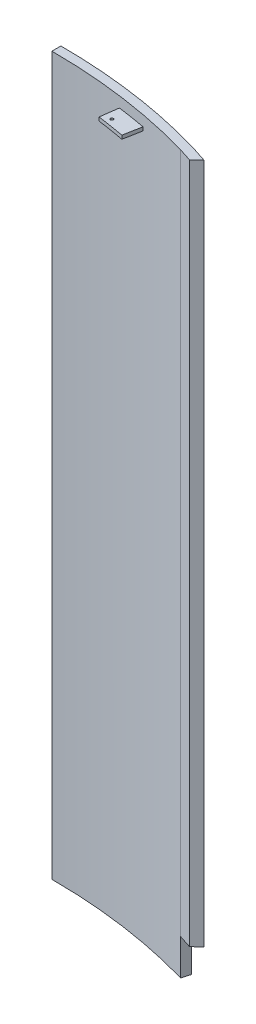
ISO-10303-21;
HEADER;
FILE_DESCRIPTION(('STEP AP214'),'2;1');
FILE_NAME('part.step','',(''),(''),'','','');
FILE_SCHEMA(('AUTOMOTIVE_DESIGN { 1 0 10303 214 1 1 1 1 }'));
ENDSEC;
DATA;
#1=APPLICATION_CONTEXT('core data for automotive mechanical design processes');
#2=APPLICATION_PROTOCOL_DEFINITION('international standard','automotive_design',2000,#1);
#3=PRODUCT_CONTEXT('',#1,'mechanical');
#4=PRODUCT('Part','Part','',(#3));
#5=PRODUCT_RELATED_PRODUCT_CATEGORY('part','',(#4));
#6=PRODUCT_DEFINITION_FORMATION('','',#4);
#7=PRODUCT_DEFINITION_CONTEXT('part definition',#1,'design');
#8=PRODUCT_DEFINITION('design','',#6,#7);
#9=PRODUCT_DEFINITION_SHAPE('','',#8);
#10=(LENGTH_UNIT() NAMED_UNIT(*) SI_UNIT(.MILLI.,.METRE.));
#11=(NAMED_UNIT(*) PLANE_ANGLE_UNIT() SI_UNIT($,.RADIAN.));
#12=(NAMED_UNIT(*) SI_UNIT($,.STERADIAN.) SOLID_ANGLE_UNIT());
#13=UNCERTAINTY_MEASURE_WITH_UNIT(LENGTH_MEASURE(1.E-05),#10,'distance_accuracy_value','');
#14=(GEOMETRIC_REPRESENTATION_CONTEXT(3) GLOBAL_UNCERTAINTY_ASSIGNED_CONTEXT((#13)) GLOBAL_UNIT_ASSIGNED_CONTEXT((#10,
#11,#12)) REPRESENTATION_CONTEXT('',''));
#15=CARTESIAN_POINT('',(0.,0.,0.));
#16=DIRECTION('',(0.,0.,1.));
#17=DIRECTION('',(1.,0.,0.));
#18=AXIS2_PLACEMENT_3D('',#15,#16,#17);
#19=CARTESIAN_POINT('',(0.,2000.,0.));
#20=DIRECTION('',(0.,-1.,0.));
#21=DIRECTION('',(0.,0.,-1.));
#22=AXIS2_PLACEMENT_3D('',#19,#20,#21);
#23=CYLINDRICAL_SURFACE('',#22,1540.);
#24=CARTESIAN_POINT('',(0.,0.,0.));
#25=DIRECTION('',(0.,1.,0.));
#26=DIRECTION('',(0.,0.,-1.));
#27=AXIS2_PLACEMENT_3D('',#24,#25,#26);
#28=CIRCLE('',#27,1540.);
#29=CARTESIAN_POINT('',(424.481527958169,0.,-1480.34301174501));
#30=VERTEX_POINT('',#29);
#31=CARTESIAN_POINT('',(0.,0.,-1540.));
#32=VERTEX_POINT('',#31);
#33=EDGE_CURVE('E169',#30,#32,#28,.T.);
#34=ORIENTED_EDGE('',*,*,#33,.T.);
#35=DIRECTION('',(0.,-1.,0.));
#36=VECTOR('',#35,1.);
#37=CARTESIAN_POINT('',(0.,2000.,-1540.));
#38=LINE('',#37,#36);
#39=CARTESIAN_POINT('',(0.,2000.,-1540.));
#40=VERTEX_POINT('',#39);
#41=EDGE_CURVE('E11',#40,#32,#38,.T.);
#42=ORIENTED_EDGE('',*,*,#41,.F.);
#43=CARTESIAN_POINT('',(0.,2000.,0.));
#44=DIRECTION('',(0.,1.,0.));
#45=DIRECTION('',(0.,0.,-1.));
#46=AXIS2_PLACEMENT_3D('',#43,#44,#45);
#47=CIRCLE('',#46,1540.);
#48=CARTESIAN_POINT('',(424.481527958166,2000.,-1480.34301174501));
#49=VERTEX_POINT('',#48);
#50=EDGE_CURVE('E184',#49,#40,#47,.T.);
#51=ORIENTED_EDGE('',*,*,#50,.F.);
#52=DIRECTION('',(0.,-1.,0.));
#53=VECTOR('',#52,1.);
#54=CARTESIAN_POINT('',(424.481527958169,2000.,-1480.34301174501));
#55=LINE('',#54,#53);
#56=CARTESIAN_POINT('',(424.481527958166,100.,-1480.34301174501));
#57=VERTEX_POINT('',#56);
#58=EDGE_CURVE('E203',#49,#57,#55,.T.);
#59=ORIENTED_EDGE('',*,*,#58,.T.);
#60=EDGE_CURVE('E193',#57,#30,#55,.T.);
#61=ORIENTED_EDGE('',*,*,#60,.T.);
#62=EDGE_LOOP('',(#34,#42,#51,#59,#61));
#63=FACE_BOUND('',#62,.T.);
#64=ADVANCED_FACE('F36',(#63),#23,.T.);
#65=CARTESIAN_POINT('',(0.,2000.,-1540.));
#66=DIRECTION('',(1.,0.,0.));
#67=DIRECTION('',(0.,0.,-1.));
#68=AXIS2_PLACEMENT_3D('',#65,#66,#67);
#69=PLANE('',#68);
#70=DIRECTION('',(0.,0.,1.));
#71=VECTOR('',#70,1.);
#72=CARTESIAN_POINT('',(0.,0.,-1540.));
#73=LINE('',#72,#71);
#74=CARTESIAN_POINT('',(0.,0.,-1515.));
#75=VERTEX_POINT('',#74);
#76=EDGE_CURVE('E196',#32,#75,#73,.T.);
#77=ORIENTED_EDGE('',*,*,#76,.T.);
#78=DIRECTION('',(0.,-1.,0.));
#79=VECTOR('',#78,1.);
#80=CARTESIAN_POINT('',(0.,2000.,-1515.));
#81=LINE('',#80,#79);
#82=CARTESIAN_POINT('',(0.,2000.,-1515.));
#83=VERTEX_POINT('',#82);
#84=EDGE_CURVE('E43',#83,#75,#81,.T.);
#85=ORIENTED_EDGE('',*,*,#84,.F.);
#86=DIRECTION('',(0.,0.,1.));
#87=VECTOR('',#86,1.);
#88=CARTESIAN_POINT('',(0.,2000.,-1540.));
#89=LINE('',#88,#87);
#90=EDGE_CURVE('E187',#40,#83,#89,.T.);
#91=ORIENTED_EDGE('',*,*,#90,.F.);
#92=ORIENTED_EDGE('',*,*,#41,.T.);
#93=EDGE_LOOP('',(#77,#85,#91,#92));
#94=FACE_BOUND('',#93,.T.);
#95=ADVANCED_FACE('F239',(#94),#69,.F.);
#96=CARTESIAN_POINT('',(0.,2000.,0.));
#97=DIRECTION('',(0.,-1.,0.));
#98=DIRECTION('',(0.,0.,-1.));
#99=AXIS2_PLACEMENT_3D('',#96,#97,#98);
#100=CYLINDRICAL_SURFACE('',#99,1515.);
#101=DIRECTION('',(0.,1.,0.));
#102=VECTOR('',#101,1.);
#103=CARTESIAN_POINT('',(279.985715854306,1960.4,-1488.9032872949));
#104=LINE('',#103,#102);
#105=CARTESIAN_POINT('',(279.985715854306,1960.4,-1488.9032872949));
#106=VERTEX_POINT('',#105);
#107=CARTESIAN_POINT('',(279.985715854306,1970.4,-1488.9032872949));
#108=VERTEX_POINT('',#107);
#109=EDGE_CURVE('E55',#106,#108,#104,.T.);
#110=ORIENTED_EDGE('',*,*,#109,.F.);
#111=CARTESIAN_POINT('',(0.,1960.4,0.));
#112=DIRECTION('',(0.,1.,0.));
#113=DIRECTION('',(0.,0.,-1.));
#114=AXIS2_PLACEMENT_3D('',#111,#112,#113);
#115=CIRCLE('',#114,1515.);
#116=CARTESIAN_POINT('',(201.678827867692,1960.4,-1501.51611725946));
#117=VERTEX_POINT('',#116);
#118=EDGE_CURVE('E50',#106,#117,#115,.T.);
#119=ORIENTED_EDGE('',*,*,#118,.T.);
#120=DIRECTION('',(0.,1.,0.));
#121=VECTOR('',#120,1.);
#122=CARTESIAN_POINT('',(201.678827867692,1960.4,-1501.51611725946));
#123=LINE('',#122,#121);
#124=CARTESIAN_POINT('',(201.678827867692,1970.4,-1501.51611725946));
#125=VERTEX_POINT('',#124);
#126=EDGE_CURVE('E156',#117,#125,#123,.T.);
#127=ORIENTED_EDGE('',*,*,#126,.T.);
#128=CARTESIAN_POINT('',(0.,1970.4,0.));
#129=DIRECTION('',(0.,1.,0.));
#130=DIRECTION('',(0.,0.,-1.));
#131=AXIS2_PLACEMENT_3D('',#128,#129,#130);
#132=CIRCLE('',#131,1515.);
#133=EDGE_CURVE('E140',#108,#125,#132,.T.);
#134=ORIENTED_EDGE('',*,*,#133,.F.);
#135=EDGE_LOOP('',(#110,#119,#127,#134));
#136=FACE_BOUND('',#135,.T.);
#137=CARTESIAN_POINT('',(0.,0.,0.));
#138=DIRECTION('',(0.,-1.,0.));
#139=DIRECTION('',(0.,0.,-1.));
#140=AXIS2_PLACEMENT_3D('',#137,#138,#139);
#141=CIRCLE('',#140,1515.);
#142=CARTESIAN_POINT('',(417.590594062744,0.,-1456.31146934656));
#143=VERTEX_POINT('',#142);
#144=EDGE_CURVE('E198',#75,#143,#141,.T.);
#145=ORIENTED_EDGE('',*,*,#144,.T.);
#146=DIRECTION('',(0.,-1.,0.));
#147=VECTOR('',#146,1.);
#148=CARTESIAN_POINT('',(417.590594062744,2000.,-1456.31146934656));
#149=LINE('',#148,#147);
#150=CARTESIAN_POINT('',(417.590594062744,100.,-1456.31146934656));
#151=VERTEX_POINT('',#150);
#152=EDGE_CURVE('E206',#151,#143,#149,.T.);
#153=ORIENTED_EDGE('',*,*,#152,.F.);
#154=CARTESIAN_POINT('',(417.590594062741,2000.,-1456.31146934656));
#155=VERTEX_POINT('',#154);
#156=EDGE_CURVE('E207',#155,#151,#149,.T.);
#157=ORIENTED_EDGE('',*,*,#156,.F.);
#158=CARTESIAN_POINT('',(0.,2000.,0.));
#159=DIRECTION('',(0.,-1.,0.));
#160=DIRECTION('',(0.,0.,-1.));
#161=AXIS2_PLACEMENT_3D('',#158,#159,#160);
#162=CIRCLE('',#161,1515.);
#163=EDGE_CURVE('E190',#83,#155,#162,.T.);
#164=ORIENTED_EDGE('',*,*,#163,.F.);
#165=ORIENTED_EDGE('',*,*,#84,.T.);
#166=EDGE_LOOP('',(#145,#153,#157,#164,#165));
#167=FACE_BOUND('',#166,.T.);
#168=ADVANCED_FACE('F213',(#136,#167),#100,.F.);
#169=CARTESIAN_POINT('',(424.481527958169,2000.,-1480.34301174501));
#170=DIRECTION('',(-0.961261695938321,0.,-0.275637355816991));
#171=DIRECTION('',(-0.275637355816991,0.,0.961261695938321));
#172=AXIS2_PLACEMENT_3D('',#169,#170,#171);
#173=PLANE('',#172);
#174=ORIENTED_EDGE('',*,*,#60,.F.);
#175=DIRECTION('',(-0.275637355816991,0.,0.961261695938321));
#176=VECTOR('',#175,1.);
#177=CARTESIAN_POINT('',(0.,100.,0.));
#178=LINE('',#177,#176);
#179=EDGE_CURVE('E159',#57,#151,#178,.T.);
#180=ORIENTED_EDGE('',*,*,#179,.T.);
#181=ORIENTED_EDGE('',*,*,#152,.T.);
#182=DIRECTION('',(0.275637355816991,0.,-0.961261695938321));
#183=VECTOR('',#182,1.);
#184=CARTESIAN_POINT('',(424.481527958169,0.,-1480.34301174501));
#185=LINE('',#184,#183);
#186=EDGE_CURVE('E188',#143,#30,#185,.T.);
#187=ORIENTED_EDGE('',*,*,#186,.T.);
#188=EDGE_LOOP('',(#174,#180,#181,#187));
#189=FACE_BOUND('',#188,.T.);
#190=ADVANCED_FACE('F223',(#189),#173,.F.);
#191=CARTESIAN_POINT('',(0.,2000.,0.));
#192=DIRECTION('',(0.,-1.,0.));
#193=DIRECTION('',(0.,0.,-1.));
#194=AXIS2_PLACEMENT_3D('',#191,#192,#193);
#195=PLANE('',#194);
#196=ORIENTED_EDGE('',*,*,#50,.T.);
#197=ORIENTED_EDGE('',*,*,#90,.T.);
#198=ORIENTED_EDGE('',*,*,#163,.T.);
#199=DIRECTION('',(0.951056516295159,0.,0.30901699437493));
#200=VECTOR('',#199,1.);
#201=CARTESIAN_POINT('',(467.875555600545,2000.,-1439.97289491861));
#202=LINE('',#201,#200);
#203=CARTESIAN_POINT('',(454.156599519565,2000.,-1444.43045396108));
#204=VERTEX_POINT('',#203);
#205=EDGE_CURVE('E175',#155,#204,#202,.T.);
#206=ORIENTED_EDGE('',*,*,#205,.T.);
#207=DIRECTION('',(-0.743144825477387,0.,0.669130606358866));
#208=VECTOR('',#207,1.);
#209=CARTESIAN_POINT('',(-514.916702356049,2000.,-571.872933731195));
#210=LINE('',#209,#208);
#211=CARTESIAN_POINT('',(475.596274339822,2000.,-1463.73482387767));
#212=VERTEX_POINT('',#211);
#213=EDGE_CURVE('E155',#212,#204,#210,.T.);
#214=ORIENTED_EDGE('',*,*,#213,.F.);
#215=DIRECTION('',(0.951056516295161,0.,0.309016994374926));
#216=VECTOR('',#215,1.);
#217=CARTESIAN_POINT('',(475.596274339822,2000.,-1463.73482387767));
#218=LINE('',#217,#216);
#219=EDGE_CURVE('E172',#49,#212,#218,.T.);
#220=ORIENTED_EDGE('',*,*,#219,.F.);
#221=EDGE_LOOP('',(#196,#197,#198,#206,#214,#220));
#222=FACE_BOUND('',#221,.T.);
#223=ADVANCED_FACE('F236',(#222),#195,.F.);
#224=CARTESIAN_POINT('',(0.,0.,0.));
#225=DIRECTION('',(0.,-1.,0.));
#226=DIRECTION('',(0.,0.,-1.));
#227=AXIS2_PLACEMENT_3D('',#224,#225,#226);
#228=PLANE('',#227);
#229=ORIENTED_EDGE('',*,*,#33,.F.);
#230=ORIENTED_EDGE('',*,*,#186,.F.);
#231=ORIENTED_EDGE('',*,*,#144,.F.);
#232=ORIENTED_EDGE('',*,*,#76,.F.);
#233=EDGE_LOOP('',(#229,#230,#231,#232));
#234=FACE_BOUND('',#233,.T.);
#235=ADVANCED_FACE('F220',(#234),#228,.T.);
#236=CARTESIAN_POINT('',(475.596274339822,31.7770511411921,-1463.73482387767));
#237=DIRECTION('',(-0.309016994374926,0.,0.951056516295161));
#238=DIRECTION('',(0.951056516295161,0.,0.309016994374926));
#239=AXIS2_PLACEMENT_3D('',#236,#237,#238);
#240=PLANE('',#239);
#241=DIRECTION('',(0.,1.,0.));
#242=VECTOR('',#241,1.);
#243=CARTESIAN_POINT('',(475.596274339822,31.7770511411921,-1463.73482387767));
#244=LINE('',#243,#242);
#245=CARTESIAN_POINT('',(475.596274339822,100.,-1463.73482387767));
#246=VERTEX_POINT('',#245);
#247=EDGE_CURVE('E178',#246,#212,#244,.T.);
#248=ORIENTED_EDGE('',*,*,#247,.F.);
#249=DIRECTION('',(-0.951056516295161,0.,-0.309016994374926));
#250=VECTOR('',#249,1.);
#251=CARTESIAN_POINT('',(475.596274339822,100.,-1463.73482387767));
#252=LINE('',#251,#250);
#253=EDGE_CURVE('E163',#246,#57,#252,.T.);
#254=ORIENTED_EDGE('',*,*,#253,.T.);
#255=ORIENTED_EDGE('',*,*,#58,.F.);
#256=ORIENTED_EDGE('',*,*,#219,.T.);
#257=EDGE_LOOP('',(#248,#254,#255,#256));
#258=FACE_BOUND('',#257,.T.);
#259=ADVANCED_FACE('F242',(#258),#240,.F.);
#260=CARTESIAN_POINT('',(467.875555600545,31.7770511411921,-1439.97289491861));
#261=DIRECTION('',(-0.30901699437493,0.,0.951056516295159));
#262=DIRECTION('',(0.951056516295159,0.,0.30901699437493));
#263=AXIS2_PLACEMENT_3D('',#260,#261,#262);
#264=PLANE('',#263);
#265=DIRECTION('',(-0.951056516295159,0.,-0.30901699437493));
#266=VECTOR('',#265,1.);
#267=CARTESIAN_POINT('',(467.875555600545,100.,-1439.97289491861));
#268=LINE('',#267,#266);
#269=CARTESIAN_POINT('',(454.156599519565,100.,-1444.43045396108));
#270=VERTEX_POINT('',#269);
#271=EDGE_CURVE('E162',#270,#151,#268,.T.);
#272=ORIENTED_EDGE('',*,*,#271,.F.);
#273=DIRECTION('',(0.,1.,0.));
#274=VECTOR('',#273,1.);
#275=CARTESIAN_POINT('',(454.156599519565,31.7770511411921,-1444.43045396108));
#276=LINE('',#275,#274);
#277=EDGE_CURVE('E179',#270,#204,#276,.T.);
#278=ORIENTED_EDGE('',*,*,#277,.T.);
#279=ORIENTED_EDGE('',*,*,#205,.F.);
#280=ORIENTED_EDGE('',*,*,#156,.T.);
#281=EDGE_LOOP('',(#272,#278,#279,#280));
#282=FACE_BOUND('',#281,.T.);
#283=ADVANCED_FACE('F226',(#282),#264,.T.);
#284=CARTESIAN_POINT('',(-514.916702356049,31.7770511411921,-571.872933731195));
#285=DIRECTION('',(-0.669130606358866,0.,-0.743144825477387));
#286=DIRECTION('',(-0.743144825477387,0.,0.669130606358866));
#287=AXIS2_PLACEMENT_3D('',#284,#285,#286);
#288=PLANE('',#287);
#289=ORIENTED_EDGE('',*,*,#277,.F.);
#290=DIRECTION('',(0.743144825477387,0.,-0.669130606358866));
#291=VECTOR('',#290,1.);
#292=CARTESIAN_POINT('',(-514.916702356049,100.,-571.872933731195));
#293=LINE('',#292,#291);
#294=EDGE_CURVE('E166',#270,#246,#293,.T.);
#295=ORIENTED_EDGE('',*,*,#294,.T.);
#296=ORIENTED_EDGE('',*,*,#247,.T.);
#297=ORIENTED_EDGE('',*,*,#213,.T.);
#298=EDGE_LOOP('',(#289,#295,#296,#297));
#299=FACE_BOUND('',#298,.T.);
#300=ADVANCED_FACE('F232',(#299),#288,.F.);
#301=CARTESIAN_POINT('',(0.,100.,0.));
#302=DIRECTION('',(0.,1.,0.));
#303=DIRECTION('',(0.309016994374933,0.,-0.951056516295158));
#304=AXIS2_PLACEMENT_3D('',#301,#302,#303);
#305=PLANE('',#304);
#306=ORIENTED_EDGE('',*,*,#271,.T.);
#307=ORIENTED_EDGE('',*,*,#179,.F.);
#308=ORIENTED_EDGE('',*,*,#253,.F.);
#309=ORIENTED_EDGE('',*,*,#294,.F.);
#310=EDGE_LOOP('',(#306,#307,#308,#309));
#311=FACE_BOUND('',#310,.T.);
#312=ADVANCED_FACE('F228',(#311),#305,.F.);
#313=CARTESIAN_POINT('',(0.,1960.4,0.));
#314=DIRECTION('',(0.,1.,0.));
#315=DIRECTION('',(0.,0.,1.));
#316=AXIS2_PLACEMENT_3D('',#313,#314,#315);
#317=CYLINDRICAL_SURFACE('',#316,1464.55099107543);
#318=CARTESIAN_POINT('',(0.,1970.4,0.));
#319=DIRECTION('',(0.,-1.,0.));
#320=DIRECTION('',(0.,0.,-1.));
#321=AXIS2_PLACEMENT_3D('',#318,#319,#320);
#322=CIRCLE('',#321,1464.55099107543);
#323=CARTESIAN_POINT('',(194.962988272317,1970.4,-1451.51611725946));
#324=VERTEX_POINT('',#323);
#325=CARTESIAN_POINT('',(270.662282271544,1970.4,-1439.32329044437));
#326=VERTEX_POINT('',#325);
#327=EDGE_CURVE('E148',#324,#326,#322,.T.);
#328=ORIENTED_EDGE('',*,*,#327,.F.);
#329=DIRECTION('',(0.,1.,0.));
#330=VECTOR('',#329,1.);
#331=CARTESIAN_POINT('',(194.962988272317,1960.4,-1451.51611725946));
#332=LINE('',#331,#330);
#333=CARTESIAN_POINT('',(194.962988272317,1960.4,-1451.51611725946));
#334=VERTEX_POINT('',#333);
#335=EDGE_CURVE('E136',#334,#324,#332,.T.);
#336=ORIENTED_EDGE('',*,*,#335,.F.);
#337=CARTESIAN_POINT('',(0.,1960.4,0.));
#338=DIRECTION('',(0.,-1.,0.));
#339=DIRECTION('',(0.,0.,-1.));
#340=AXIS2_PLACEMENT_3D('',#337,#338,#339);
#341=CIRCLE('',#340,1464.55099107543);
#342=CARTESIAN_POINT('',(270.662282271544,1960.4,-1439.32329044437));
#343=VERTEX_POINT('',#342);
#344=EDGE_CURVE('E132',#334,#343,#341,.T.);
#345=ORIENTED_EDGE('',*,*,#344,.T.);
#346=DIRECTION('',(0.,1.,0.));
#347=VECTOR('',#346,1.);
#348=CARTESIAN_POINT('',(270.662282271544,1960.4,-1439.32329044437));
#349=LINE('',#348,#347);
#350=EDGE_CURVE('E116',#343,#326,#349,.T.);
#351=ORIENTED_EDGE('',*,*,#350,.T.);
#352=EDGE_LOOP('',(#328,#336,#345,#351));
#353=FACE_BOUND('',#352,.T.);
#354=ADVANCED_FACE('F135',(#353),#317,.F.);
#355=CARTESIAN_POINT('',(201.678827867692,1960.4,-1501.51611725946));
#356=DIRECTION('',(-0.991099747365978,0.,-0.133121338526528));
#357=DIRECTION('',(-0.133121338526528,0.,0.991099747365978));
#358=AXIS2_PLACEMENT_3D('',#355,#356,#357);
#359=PLANE('',#358);
#360=DIRECTION('',(-0.133121338526528,0.,0.991099747365978));
#361=VECTOR('',#360,1.);
#362=CARTESIAN_POINT('',(201.678827867692,1970.4,-1501.51611725946));
#363=LINE('',#362,#361);
#364=EDGE_CURVE('E137',#125,#324,#363,.T.);
#365=ORIENTED_EDGE('',*,*,#364,.F.);
#366=ORIENTED_EDGE('',*,*,#126,.F.);
#367=DIRECTION('',(-0.133121338526528,0.,0.991099747365978));
#368=VECTOR('',#367,1.);
#369=CARTESIAN_POINT('',(201.678827867692,1960.4,-1501.51611725946));
#370=LINE('',#369,#368);
#371=EDGE_CURVE('E126',#117,#334,#370,.T.);
#372=ORIENTED_EDGE('',*,*,#371,.T.);
#373=ORIENTED_EDGE('',*,*,#335,.T.);
#374=EDGE_LOOP('',(#365,#366,#372,#373));
#375=FACE_BOUND('',#374,.T.);
#376=ADVANCED_FACE('F272',(#375),#359,.T.);
#377=CARTESIAN_POINT('',(279.985715854306,1960.4,-1488.9032872949));
#378=DIRECTION('',(0.98277444705934,0.,0.184809053369171));
#379=DIRECTION('',(0.184809053369171,0.,-0.98277444705934));
#380=AXIS2_PLACEMENT_3D('',#377,#378,#379);
#381=PLANE('',#380);
#382=DIRECTION('',(0.184809053369171,0.,-0.98277444705934));
#383=VECTOR('',#382,1.);
#384=CARTESIAN_POINT('',(279.985715854306,1970.4,-1488.9032872949));
#385=LINE('',#384,#383);
#386=EDGE_CURVE('E121',#326,#108,#385,.T.);
#387=ORIENTED_EDGE('',*,*,#386,.F.);
#388=ORIENTED_EDGE('',*,*,#350,.F.);
#389=DIRECTION('',(0.184809053369171,0.,-0.98277444705934));
#390=VECTOR('',#389,1.);
#391=CARTESIAN_POINT('',(279.985715854306,1960.4,-1488.9032872949));
#392=LINE('',#391,#390);
#393=EDGE_CURVE('E119',#343,#106,#392,.T.);
#394=ORIENTED_EDGE('',*,*,#393,.T.);
#395=ORIENTED_EDGE('',*,*,#109,.T.);
#396=EDGE_LOOP('',(#387,#388,#394,#395));
#397=FACE_BOUND('',#396,.T.);
#398=ADVANCED_FACE('F118',(#397),#381,.T.);
#399=CARTESIAN_POINT('',(0.,1960.4,0.));
#400=DIRECTION('',(0.,-1.,0.));
#401=DIRECTION('',(0.,0.,-1.));
#402=AXIS2_PLACEMENT_3D('',#399,#400,#401);
#403=PLANE('',#402);
#404=CARTESIAN_POINT('',(217.889718701478,1960.4,-1464.14707185571));
#405=DIRECTION('',(0.,1.,0.));
#406=DIRECTION('',(0.,0.,1.));
#407=AXIS2_PLACEMENT_3D('',#404,#405,#406);
#408=CIRCLE('',#407,4.00000000000007);
#409=CARTESIAN_POINT('',(217.889718701478,1960.4,-1460.14707185571));
#410=VERTEX_POINT('',#409);
#411=EDGE_CURVE('E150',#410,#410,#408,.T.);
#412=ORIENTED_EDGE('',*,*,#411,.T.);
#413=EDGE_LOOP('',(#412));
#414=FACE_BOUND('',#413,.T.);
#415=ORIENTED_EDGE('',*,*,#344,.F.);
#416=ORIENTED_EDGE('',*,*,#371,.F.);
#417=ORIENTED_EDGE('',*,*,#118,.F.);
#418=ORIENTED_EDGE('',*,*,#393,.F.);
#419=EDGE_LOOP('',(#415,#416,#417,#418));
#420=FACE_BOUND('',#419,.T.);
#421=ADVANCED_FACE('F130',(#414,#420),#403,.T.);
#422=CARTESIAN_POINT('',(0.,1970.4,0.));
#423=DIRECTION('',(0.,-1.,0.));
#424=DIRECTION('',(0.,0.,-1.));
#425=AXIS2_PLACEMENT_3D('',#422,#423,#424);
#426=PLANE('',#425);
#427=CARTESIAN_POINT('',(217.889718701478,1970.4,-1464.14707185571));
#428=DIRECTION('',(0.,1.,0.));
#429=DIRECTION('',(0.,0.,1.));
#430=AXIS2_PLACEMENT_3D('',#427,#428,#429);
#431=CIRCLE('',#430,4.00000000000007);
#432=CARTESIAN_POINT('',(217.889718701478,1970.4,-1460.14707185571));
#433=VERTEX_POINT('',#432);
#434=EDGE_CURVE('E143',#433,#433,#431,.T.);
#435=ORIENTED_EDGE('',*,*,#434,.F.);
#436=EDGE_LOOP('',(#435));
#437=FACE_BOUND('',#436,.T.);
#438=ORIENTED_EDGE('',*,*,#327,.T.);
#439=ORIENTED_EDGE('',*,*,#386,.T.);
#440=ORIENTED_EDGE('',*,*,#133,.T.);
#441=ORIENTED_EDGE('',*,*,#364,.T.);
#442=EDGE_LOOP('',(#438,#439,#440,#441));
#443=FACE_BOUND('',#442,.T.);
#444=ADVANCED_FACE('F280',(#437,#443),#426,.F.);
#445=CARTESIAN_POINT('',(217.889718701478,1960.4,-1464.14707185571));
#446=DIRECTION('',(0.,1.,0.));
#447=DIRECTION('',(0.,0.,1.));
#448=AXIS2_PLACEMENT_3D('',#445,#446,#447);
#449=CYLINDRICAL_SURFACE('',#448,4.00000000000007);
#450=ORIENTED_EDGE('',*,*,#411,.F.);
#451=EDGE_LOOP('',(#450));
#452=FACE_BOUND('',#451,.T.);
#453=ORIENTED_EDGE('',*,*,#434,.T.);
#454=EDGE_LOOP('',(#453));
#455=FACE_BOUND('',#454,.T.);
#456=ADVANCED_FACE('F283',(#452,#455),#449,.F.);
#457=CLOSED_SHELL('',(#64,#95,#168,#190,#223,#235,#259,#283,#300,#312,#354,#376,#398,#421,#444,#456));
#458=MANIFOLD_SOLID_BREP('B2',#457);
#459=ADVANCED_BREP_SHAPE_REPRESENTATION('',(#18,#458),#14);
#460=SHAPE_DEFINITION_REPRESENTATION(#9,#459);
ENDSEC;
END-ISO-10303-21;
